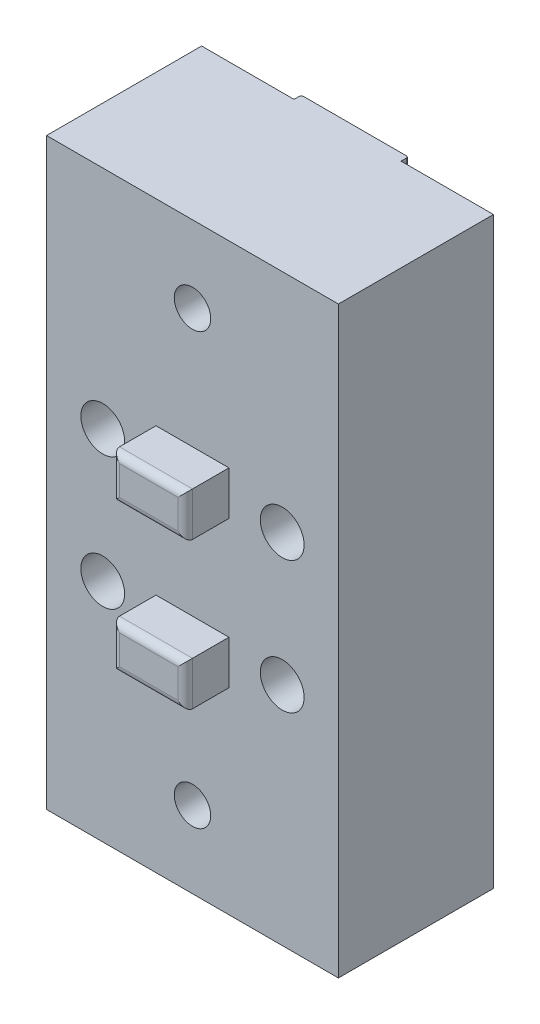
ISO-10303-21;
HEADER;
FILE_DESCRIPTION(('STEP AP214'),'2;1');
FILE_NAME('part.step','',(''),(''),'','','');
FILE_SCHEMA(('AUTOMOTIVE_DESIGN { 1 0 10303 214 1 1 1 1 }'));
ENDSEC;
DATA;
#1=APPLICATION_CONTEXT('core data for automotive mechanical design processes');
#2=APPLICATION_PROTOCOL_DEFINITION('international standard','automotive_design',2000,#1);
#3=PRODUCT_CONTEXT('',#1,'mechanical');
#4=PRODUCT('Part','Part','',(#3));
#5=PRODUCT_RELATED_PRODUCT_CATEGORY('part','',(#4));
#6=PRODUCT_DEFINITION_FORMATION('','',#4);
#7=PRODUCT_DEFINITION_CONTEXT('part definition',#1,'design');
#8=PRODUCT_DEFINITION('design','',#6,#7);
#9=PRODUCT_DEFINITION_SHAPE('','',#8);
#10=(LENGTH_UNIT() NAMED_UNIT(*) SI_UNIT(.MILLI.,.METRE.));
#11=(NAMED_UNIT(*) PLANE_ANGLE_UNIT() SI_UNIT($,.RADIAN.));
#12=(NAMED_UNIT(*) SI_UNIT($,.STERADIAN.) SOLID_ANGLE_UNIT());
#13=UNCERTAINTY_MEASURE_WITH_UNIT(LENGTH_MEASURE(1.E-05),#10,'distance_accuracy_value','');
#14=(GEOMETRIC_REPRESENTATION_CONTEXT(3) GLOBAL_UNCERTAINTY_ASSIGNED_CONTEXT((#13)) GLOBAL_UNIT_ASSIGNED_CONTEXT((#10,
#11,#12)) REPRESENTATION_CONTEXT('',''));
#15=CARTESIAN_POINT('',(0.,0.,0.));
#16=DIRECTION('',(0.,0.,1.));
#17=DIRECTION('',(1.,0.,0.));
#18=AXIS2_PLACEMENT_3D('',#15,#16,#17);
#19=CARTESIAN_POINT('',(12.3,9.05,21.25));
#20=DIRECTION('',(0.,0.,-1.));
#21=DIRECTION('',(-1.,0.,0.));
#22=AXIS2_PLACEMENT_3D('',#19,#20,#21);
#23=CYLINDRICAL_SURFACE('',#22,2.);
#24=CARTESIAN_POINT('',(12.3,9.05,0.));
#25=DIRECTION('',(0.,0.,1.));
#26=DIRECTION('',(1.,0.,0.));
#27=AXIS2_PLACEMENT_3D('',#24,#25,#26);
#28=CIRCLE('',#27,2.);
#29=CARTESIAN_POINT('',(14.3,9.05,0.));
#30=VERTEX_POINT('',#29);
#31=EDGE_CURVE('E288',#30,#30,#28,.T.);
#32=ORIENTED_EDGE('',*,*,#31,.F.);
#33=EDGE_LOOP('',(#32));
#34=FACE_BOUND('',#33,.T.);
#35=CARTESIAN_POINT('',(12.3,9.05,15.25));
#36=DIRECTION('',(0.,0.,1.));
#37=DIRECTION('',(1.,0.,0.));
#38=AXIS2_PLACEMENT_3D('',#35,#36,#37);
#39=CIRCLE('',#38,2.);
#40=CARTESIAN_POINT('',(14.3,9.05,15.25));
#41=VERTEX_POINT('',#40);
#42=EDGE_CURVE('E357',#41,#41,#39,.T.);
#43=ORIENTED_EDGE('',*,*,#42,.T.);
#44=EDGE_LOOP('',(#43));
#45=FACE_BOUND('',#44,.T.);
#46=ADVANCED_FACE('F63',(#34,#45),#23,.F.);
#47=CARTESIAN_POINT('',(12.3,-9.05,21.25));
#48=DIRECTION('',(0.,0.,-1.));
#49=DIRECTION('',(-1.,0.,0.));
#50=AXIS2_PLACEMENT_3D('',#47,#48,#49);
#51=CYLINDRICAL_SURFACE('',#50,2.);
#52=CARTESIAN_POINT('',(12.3,-9.05,0.));
#53=DIRECTION('',(0.,0.,1.));
#54=DIRECTION('',(1.,0.,0.));
#55=AXIS2_PLACEMENT_3D('',#52,#53,#54);
#56=CIRCLE('',#55,2.);
#57=CARTESIAN_POINT('',(14.3,-9.05,0.));
#58=VERTEX_POINT('',#57);
#59=EDGE_CURVE('E285',#58,#58,#56,.T.);
#60=ORIENTED_EDGE('',*,*,#59,.F.);
#61=EDGE_LOOP('',(#60));
#62=FACE_BOUND('',#61,.T.);
#63=CARTESIAN_POINT('',(12.3,-9.05,15.25));
#64=DIRECTION('',(0.,0.,1.));
#65=DIRECTION('',(1.,0.,0.));
#66=AXIS2_PLACEMENT_3D('',#63,#64,#65);
#67=CIRCLE('',#66,2.);
#68=CARTESIAN_POINT('',(14.3,-9.05,15.25));
#69=VERTEX_POINT('',#68);
#70=EDGE_CURVE('E354',#69,#69,#67,.T.);
#71=ORIENTED_EDGE('',*,*,#70,.T.);
#72=EDGE_LOOP('',(#71));
#73=FACE_BOUND('',#72,.T.);
#74=ADVANCED_FACE('F445',(#62,#73),#51,.F.);
#75=CARTESIAN_POINT('',(-12.3,9.05,21.25));
#76=DIRECTION('',(0.,0.,-1.));
#77=DIRECTION('',(-1.,0.,0.));
#78=AXIS2_PLACEMENT_3D('',#75,#76,#77);
#79=CYLINDRICAL_SURFACE('',#78,2.);
#80=CARTESIAN_POINT('',(-12.3,9.05,0.));
#81=DIRECTION('',(0.,0.,1.));
#82=DIRECTION('',(1.,0.,0.));
#83=AXIS2_PLACEMENT_3D('',#80,#81,#82);
#84=CIRCLE('',#83,2.);
#85=CARTESIAN_POINT('',(-10.3,9.05,0.));
#86=VERTEX_POINT('',#85);
#87=EDGE_CURVE('E282',#86,#86,#84,.T.);
#88=ORIENTED_EDGE('',*,*,#87,.F.);
#89=EDGE_LOOP('',(#88));
#90=FACE_BOUND('',#89,.T.);
#91=CARTESIAN_POINT('',(-12.3,9.05,15.25));
#92=DIRECTION('',(0.,0.,1.));
#93=DIRECTION('',(1.,0.,0.));
#94=AXIS2_PLACEMENT_3D('',#91,#92,#93);
#95=CIRCLE('',#94,2.);
#96=CARTESIAN_POINT('',(-10.3,9.05,15.25));
#97=VERTEX_POINT('',#96);
#98=EDGE_CURVE('E350',#97,#97,#95,.T.);
#99=ORIENTED_EDGE('',*,*,#98,.T.);
#100=EDGE_LOOP('',(#99));
#101=FACE_BOUND('',#100,.T.);
#102=ADVANCED_FACE('F452',(#90,#101),#79,.F.);
#103=CARTESIAN_POINT('',(-12.3,-9.05,21.25));
#104=DIRECTION('',(0.,0.,-1.));
#105=DIRECTION('',(-1.,0.,0.));
#106=AXIS2_PLACEMENT_3D('',#103,#104,#105);
#107=CYLINDRICAL_SURFACE('',#106,2.);
#108=CARTESIAN_POINT('',(-12.3,-9.05,0.));
#109=DIRECTION('',(0.,0.,1.));
#110=DIRECTION('',(1.,0.,0.));
#111=AXIS2_PLACEMENT_3D('',#108,#109,#110);
#112=CIRCLE('',#111,2.);
#113=CARTESIAN_POINT('',(-10.3,-9.05,0.));
#114=VERTEX_POINT('',#113);
#115=EDGE_CURVE('E279',#114,#114,#112,.T.);
#116=ORIENTED_EDGE('',*,*,#115,.F.);
#117=EDGE_LOOP('',(#116));
#118=FACE_BOUND('',#117,.T.);
#119=CARTESIAN_POINT('',(-12.3,-9.05,15.25));
#120=DIRECTION('',(0.,0.,1.));
#121=DIRECTION('',(1.,0.,0.));
#122=AXIS2_PLACEMENT_3D('',#119,#120,#121);
#123=CIRCLE('',#122,2.);
#124=CARTESIAN_POINT('',(-10.3,-9.05,15.25));
#125=VERTEX_POINT('',#124);
#126=EDGE_CURVE('E347',#125,#125,#123,.T.);
#127=ORIENTED_EDGE('',*,*,#126,.T.);
#128=EDGE_LOOP('',(#127));
#129=FACE_BOUND('',#128,.T.);
#130=ADVANCED_FACE('F491',(#118,#129),#107,.F.);
#131=CARTESIAN_POINT('',(-7.085,-40.,-0.75));
#132=DIRECTION('',(0.,1.,0.));
#133=DIRECTION('',(0.,0.,1.));
#134=AXIS2_PLACEMENT_3D('',#131,#132,#133);
#135=CYLINDRICAL_SURFACE('',#134,0.25);
#136=DIRECTION('',(0.,-1.,0.));
#137=VECTOR('',#136,1.);
#138=CARTESIAN_POINT('',(-7.335,-40.,-0.75));
#139=LINE('',#138,#137);
#140=CARTESIAN_POINT('',(-7.335,40.,-0.75));
#141=VERTEX_POINT('',#140);
#142=CARTESIAN_POINT('',(-7.335,-40.,-0.75));
#143=VERTEX_POINT('',#142);
#144=EDGE_CURVE('E336',#141,#143,#139,.T.);
#145=ORIENTED_EDGE('',*,*,#144,.F.);
#146=CARTESIAN_POINT('',(-7.085,40.,-0.75));
#147=DIRECTION('',(0.,-1.,0.));
#148=DIRECTION('',(0.,0.,-1.));
#149=AXIS2_PLACEMENT_3D('',#146,#147,#148);
#150=CIRCLE('',#149,0.25);
#151=CARTESIAN_POINT('',(-7.085,40.,-1.));
#152=VERTEX_POINT('',#151);
#153=EDGE_CURVE('E342',#152,#141,#150,.F.);
#154=ORIENTED_EDGE('',*,*,#153,.F.);
#155=DIRECTION('',(0.,-1.,0.));
#156=VECTOR('',#155,1.);
#157=CARTESIAN_POINT('',(-7.085,-40.,-1.));
#158=LINE('',#157,#156);
#159=CARTESIAN_POINT('',(-7.085,-40.,-1.));
#160=VERTEX_POINT('',#159);
#161=EDGE_CURVE('E339',#160,#152,#158,.F.);
#162=ORIENTED_EDGE('',*,*,#161,.F.);
#163=CARTESIAN_POINT('',(-7.085,-40.,-0.75));
#164=DIRECTION('',(0.,1.,0.));
#165=DIRECTION('',(0.,0.,1.));
#166=AXIS2_PLACEMENT_3D('',#163,#164,#165);
#167=CIRCLE('',#166,0.25);
#168=EDGE_CURVE('E344',#143,#160,#167,.F.);
#169=ORIENTED_EDGE('',*,*,#168,.F.);
#170=EDGE_LOOP('',(#145,#154,#162,#169));
#171=FACE_BOUND('',#170,.T.);
#172=ADVANCED_FACE('F487',(#171),#135,.T.);
#173=CARTESIAN_POINT('',(7.085,40.,-0.75));
#174=DIRECTION('',(0.,-1.,0.));
#175=DIRECTION('',(0.,0.,-1.));
#176=AXIS2_PLACEMENT_3D('',#173,#174,#175);
#177=CYLINDRICAL_SURFACE('',#176,0.25);
#178=DIRECTION('',(0.,1.,0.));
#179=VECTOR('',#178,1.);
#180=CARTESIAN_POINT('',(7.335,40.,-0.75));
#181=LINE('',#180,#179);
#182=CARTESIAN_POINT('',(7.335,-40.,-0.75));
#183=VERTEX_POINT('',#182);
#184=CARTESIAN_POINT('',(7.335,40.,-0.75));
#185=VERTEX_POINT('',#184);
#186=EDGE_CURVE('E325',#183,#185,#181,.T.);
#187=ORIENTED_EDGE('',*,*,#186,.F.);
#188=CARTESIAN_POINT('',(7.085,-40.,-0.75));
#189=DIRECTION('',(0.,1.,0.));
#190=DIRECTION('',(0.,0.,1.));
#191=AXIS2_PLACEMENT_3D('',#188,#189,#190);
#192=CIRCLE('',#191,0.25);
#193=CARTESIAN_POINT('',(7.085,-40.,-1.));
#194=VERTEX_POINT('',#193);
#195=EDGE_CURVE('E331',#194,#183,#192,.F.);
#196=ORIENTED_EDGE('',*,*,#195,.F.);
#197=DIRECTION('',(0.,1.,0.));
#198=VECTOR('',#197,1.);
#199=CARTESIAN_POINT('',(7.085,40.,-1.));
#200=LINE('',#199,#198);
#201=CARTESIAN_POINT('',(7.085,40.,-1.));
#202=VERTEX_POINT('',#201);
#203=EDGE_CURVE('E328',#202,#194,#200,.F.);
#204=ORIENTED_EDGE('',*,*,#203,.F.);
#205=CARTESIAN_POINT('',(7.085,40.,-0.75));
#206=DIRECTION('',(0.,-1.,0.));
#207=DIRECTION('',(0.,0.,-1.));
#208=AXIS2_PLACEMENT_3D('',#205,#206,#207);
#209=CIRCLE('',#208,0.25);
#210=EDGE_CURVE('E333',#185,#202,#209,.F.);
#211=ORIENTED_EDGE('',*,*,#210,.F.);
#212=EDGE_LOOP('',(#187,#196,#204,#211));
#213=FACE_BOUND('',#212,.T.);
#214=ADVANCED_FACE('F467',(#213),#177,.T.);
#215=CARTESIAN_POINT('',(0.,0.,0.));
#216=DIRECTION('',(0.,0.,1.));
#217=DIRECTION('',(1.,0.,0.));
#218=AXIS2_PLACEMENT_3D('',#215,#216,#217);
#219=PLANE('',#218);
#220=ORIENTED_EDGE('',*,*,#115,.T.);
#221=EDGE_LOOP('',(#220));
#222=FACE_BOUND('',#221,.T.);
#223=ORIENTED_EDGE('',*,*,#87,.T.);
#224=EDGE_LOOP('',(#223));
#225=FACE_BOUND('',#224,.T.);
#226=DIRECTION('',(0.,1.,0.));
#227=VECTOR('',#226,1.);
#228=CARTESIAN_POINT('',(-7.335,-40.,0.));
#229=LINE('',#228,#227);
#230=CARTESIAN_POINT('',(-7.335,-40.,0.));
#231=VERTEX_POINT('',#230);
#232=CARTESIAN_POINT('',(-7.335,40.,0.));
#233=VERTEX_POINT('',#232);
#234=EDGE_CURVE('E264',#231,#233,#229,.T.);
#235=ORIENTED_EDGE('',*,*,#234,.F.);
#236=DIRECTION('',(1.,0.,0.));
#237=VECTOR('',#236,1.);
#238=CARTESIAN_POINT('',(-20.,-40.,0.));
#239=LINE('',#238,#237);
#240=CARTESIAN_POINT('',(-20.,-40.,0.));
#241=VERTEX_POINT('',#240);
#242=EDGE_CURVE('E306',#241,#231,#239,.T.);
#243=ORIENTED_EDGE('',*,*,#242,.F.);
#244=DIRECTION('',(0.,-1.,0.));
#245=VECTOR('',#244,1.);
#246=CARTESIAN_POINT('',(-20.,40.,0.));
#247=LINE('',#246,#245);
#248=CARTESIAN_POINT('',(-20.,40.,0.));
#249=VERTEX_POINT('',#248);
#250=EDGE_CURVE('E291',#249,#241,#247,.T.);
#251=ORIENTED_EDGE('',*,*,#250,.F.);
#252=DIRECTION('',(-1.,0.,0.));
#253=VECTOR('',#252,1.);
#254=CARTESIAN_POINT('',(-20.,40.,0.));
#255=LINE('',#254,#253);
#256=EDGE_CURVE('E311',#233,#249,#255,.T.);
#257=ORIENTED_EDGE('',*,*,#256,.F.);
#258=EDGE_LOOP('',(#235,#243,#251,#257));
#259=FACE_BOUND('',#258,.T.);
#260=ADVANCED_FACE('F464',(#222,#225,#259),#219,.F.);
#261=ORIENTED_EDGE('',*,*,#59,.T.);
#262=EDGE_LOOP('',(#261));
#263=FACE_BOUND('',#262,.T.);
#264=ORIENTED_EDGE('',*,*,#31,.T.);
#265=EDGE_LOOP('',(#264));
#266=FACE_BOUND('',#265,.T.);
#267=DIRECTION('',(0.,-1.,0.));
#268=VECTOR('',#267,1.);
#269=CARTESIAN_POINT('',(7.335,40.,0.));
#270=LINE('',#269,#268);
#271=CARTESIAN_POINT('',(7.335,40.,0.));
#272=VERTEX_POINT('',#271);
#273=CARTESIAN_POINT('',(7.335,-40.,0.));
#274=VERTEX_POINT('',#273);
#275=EDGE_CURVE('E260',#272,#274,#270,.T.);
#276=ORIENTED_EDGE('',*,*,#275,.F.);
#277=CARTESIAN_POINT('',(20.,40.,0.));
#278=VERTEX_POINT('',#277);
#279=EDGE_CURVE('E296',#278,#272,#255,.T.);
#280=ORIENTED_EDGE('',*,*,#279,.F.);
#281=DIRECTION('',(0.,1.,0.));
#282=VECTOR('',#281,1.);
#283=CARTESIAN_POINT('',(20.,40.,0.));
#284=LINE('',#283,#282);
#285=CARTESIAN_POINT('',(20.,-40.,0.));
#286=VERTEX_POINT('',#285);
#287=EDGE_CURVE('E309',#286,#278,#284,.T.);
#288=ORIENTED_EDGE('',*,*,#287,.F.);
#289=EDGE_CURVE('E305',#274,#286,#239,.T.);
#290=ORIENTED_EDGE('',*,*,#289,.F.);
#291=EDGE_LOOP('',(#276,#280,#288,#290));
#292=FACE_BOUND('',#291,.T.);
#293=ADVANCED_FACE('F462',(#263,#266,#292),#219,.F.);
#294=CARTESIAN_POINT('',(0.,0.,21.25));
#295=DIRECTION('',(0.,0.,1.));
#296=DIRECTION('',(1.,0.,0.));
#297=AXIS2_PLACEMENT_3D('',#294,#295,#296);
#298=PLANE('',#297);
#299=CARTESIAN_POINT('',(-12.3,-9.05,21.25));
#300=DIRECTION('',(0.,0.,1.));
#301=DIRECTION('',(1.,0.,0.));
#302=AXIS2_PLACEMENT_3D('',#299,#300,#301);
#303=CIRCLE('',#302,3.);
#304=CARTESIAN_POINT('',(-9.3,-9.05,21.25));
#305=VERTEX_POINT('',#304);
#306=EDGE_CURVE('E871',#305,#305,#303,.T.);
#307=ORIENTED_EDGE('',*,*,#306,.F.);
#308=EDGE_LOOP('',(#307));
#309=FACE_BOUND('',#308,.T.);
#310=CARTESIAN_POINT('',(12.3,-9.05,21.25));
#311=DIRECTION('',(0.,0.,1.));
#312=DIRECTION('',(1.,0.,0.));
#313=AXIS2_PLACEMENT_3D('',#310,#311,#312);
#314=CIRCLE('',#313,3.);
#315=CARTESIAN_POINT('',(15.3,-9.05,21.25));
#316=VERTEX_POINT('',#315);
#317=EDGE_CURVE('E870',#316,#316,#314,.T.);
#318=ORIENTED_EDGE('',*,*,#317,.F.);
#319=EDGE_LOOP('',(#318));
#320=FACE_BOUND('',#319,.T.);
#321=CARTESIAN_POINT('',(12.3,9.05,21.25));
#322=DIRECTION('',(0.,0.,1.));
#323=DIRECTION('',(1.,0.,0.));
#324=AXIS2_PLACEMENT_3D('',#321,#322,#323);
#325=CIRCLE('',#324,3.);
#326=CARTESIAN_POINT('',(15.3,9.05,21.25));
#327=VERTEX_POINT('',#326);
#328=EDGE_CURVE('E887',#327,#327,#325,.T.);
#329=ORIENTED_EDGE('',*,*,#328,.F.);
#330=EDGE_LOOP('',(#329));
#331=FACE_BOUND('',#330,.T.);
#332=CARTESIAN_POINT('',(-12.3,9.05,21.25));
#333=DIRECTION('',(0.,0.,1.));
#334=DIRECTION('',(1.,0.,0.));
#335=AXIS2_PLACEMENT_3D('',#332,#333,#334);
#336=CIRCLE('',#335,3.);
#337=CARTESIAN_POINT('',(-9.3,9.05,21.25));
#338=VERTEX_POINT('',#337);
#339=EDGE_CURVE('E884',#338,#338,#336,.T.);
#340=ORIENTED_EDGE('',*,*,#339,.F.);
#341=EDGE_LOOP('',(#340));
#342=FACE_BOUND('',#341,.T.);
#343=CARTESIAN_POINT('',(0.,29.5,21.25));
#344=DIRECTION('',(0.,0.,1.));
#345=DIRECTION('',(1.,0.,0.));
#346=AXIS2_PLACEMENT_3D('',#343,#344,#345);
#347=CIRCLE('',#346,2.5);
#348=CARTESIAN_POINT('',(2.5,29.5,21.25));
#349=VERTEX_POINT('',#348);
#350=EDGE_CURVE('E896',#349,#349,#347,.T.);
#351=ORIENTED_EDGE('',*,*,#350,.F.);
#352=EDGE_LOOP('',(#351));
#353=FACE_BOUND('',#352,.T.);
#354=CARTESIAN_POINT('',(0.,-29.5,21.25));
#355=DIRECTION('',(0.,0.,1.));
#356=DIRECTION('',(1.,0.,0.));
#357=AXIS2_PLACEMENT_3D('',#354,#355,#356);
#358=CIRCLE('',#357,2.5);
#359=CARTESIAN_POINT('',(2.5,-29.5,21.25));
#360=VERTEX_POINT('',#359);
#361=EDGE_CURVE('E891',#360,#360,#358,.T.);
#362=ORIENTED_EDGE('',*,*,#361,.F.);
#363=EDGE_LOOP('',(#362));
#364=FACE_BOUND('',#363,.T.);
#365=DIRECTION('',(1.,0.,0.));
#366=VECTOR('',#365,1.);
#367=CARTESIAN_POINT('',(0.,13.05,21.25));
#368=LINE('',#367,#366);
#369=CARTESIAN_POINT('',(-5.,13.05,21.25));
#370=VERTEX_POINT('',#369);
#371=CARTESIAN_POINT('',(5.,13.05,21.25));
#372=VERTEX_POINT('',#371);
#373=EDGE_CURVE('E235',#370,#372,#368,.T.);
#374=ORIENTED_EDGE('',*,*,#373,.T.);
#375=DIRECTION('',(0.,1.,0.));
#376=VECTOR('',#375,1.);
#377=CARTESIAN_POINT('',(5.,0.,21.25));
#378=LINE('',#377,#376);
#379=CARTESIAN_POINT('',(5.,7.05,21.25));
#380=VERTEX_POINT('',#379);
#381=EDGE_CURVE('E232',#380,#372,#378,.T.);
#382=ORIENTED_EDGE('',*,*,#381,.F.);
#383=DIRECTION('',(1.,0.,0.));
#384=VECTOR('',#383,1.);
#385=CARTESIAN_POINT('',(0.,7.05,21.25));
#386=LINE('',#385,#384);
#387=CARTESIAN_POINT('',(-5.,7.05,21.25));
#388=VERTEX_POINT('',#387);
#389=EDGE_CURVE('E216',#388,#380,#386,.T.);
#390=ORIENTED_EDGE('',*,*,#389,.F.);
#391=DIRECTION('',(0.,1.,0.));
#392=VECTOR('',#391,1.);
#393=CARTESIAN_POINT('',(-5.,0.,21.25));
#394=LINE('',#393,#392);
#395=EDGE_CURVE('E229',#388,#370,#394,.T.);
#396=ORIENTED_EDGE('',*,*,#395,.T.);
#397=EDGE_LOOP('',(#374,#382,#390,#396));
#398=FACE_BOUND('',#397,.T.);
#399=DIRECTION('',(0.,-1.,0.));
#400=VECTOR('',#399,1.);
#401=CARTESIAN_POINT('',(5.,0.,21.25));
#402=LINE('',#401,#400);
#403=CARTESIAN_POINT('',(5.,-7.05,21.25));
#404=VERTEX_POINT('',#403);
#405=CARTESIAN_POINT('',(5.,-13.05,21.25));
#406=VERTEX_POINT('',#405);
#407=EDGE_CURVE('E237',#404,#406,#402,.T.);
#408=ORIENTED_EDGE('',*,*,#407,.T.);
#409=DIRECTION('',(1.,0.,0.));
#410=VECTOR('',#409,1.);
#411=CARTESIAN_POINT('',(0.,-13.05,21.25));
#412=LINE('',#411,#410);
#413=CARTESIAN_POINT('',(-5.,-13.05,21.25));
#414=VERTEX_POINT('',#413);
#415=EDGE_CURVE('E249',#414,#406,#412,.T.);
#416=ORIENTED_EDGE('',*,*,#415,.F.);
#417=DIRECTION('',(0.,-1.,0.));
#418=VECTOR('',#417,1.);
#419=CARTESIAN_POINT('',(-5.,0.,21.25));
#420=LINE('',#419,#418);
#421=CARTESIAN_POINT('',(-5.,-7.05,21.25));
#422=VERTEX_POINT('',#421);
#423=EDGE_CURVE('E246',#422,#414,#420,.T.);
#424=ORIENTED_EDGE('',*,*,#423,.F.);
#425=DIRECTION('',(1.,0.,0.));
#426=VECTOR('',#425,1.);
#427=CARTESIAN_POINT('',(0.,-7.05,21.25));
#428=LINE('',#427,#426);
#429=EDGE_CURVE('E243',#422,#404,#428,.T.);
#430=ORIENTED_EDGE('',*,*,#429,.T.);
#431=EDGE_LOOP('',(#408,#416,#424,#430));
#432=FACE_BOUND('',#431,.T.);
#433=DIRECTION('',(0.,-1.,0.));
#434=VECTOR('',#433,1.);
#435=CARTESIAN_POINT('',(-20.,40.,21.25));
#436=LINE('',#435,#434);
#437=CARTESIAN_POINT('',(-20.,40.,21.25));
#438=VERTEX_POINT('',#437);
#439=CARTESIAN_POINT('',(-20.,-40.,21.25));
#440=VERTEX_POINT('',#439);
#441=EDGE_CURVE('E292',#438,#440,#436,.T.);
#442=ORIENTED_EDGE('',*,*,#441,.T.);
#443=DIRECTION('',(1.,0.,0.));
#444=VECTOR('',#443,1.);
#445=CARTESIAN_POINT('',(-20.,-40.,21.25));
#446=LINE('',#445,#444);
#447=CARTESIAN_POINT('',(20.,-40.,21.25));
#448=VERTEX_POINT('',#447);
#449=EDGE_CURVE('E295',#440,#448,#446,.T.);
#450=ORIENTED_EDGE('',*,*,#449,.T.);
#451=DIRECTION('',(0.,1.,0.));
#452=VECTOR('',#451,1.);
#453=CARTESIAN_POINT('',(20.,40.,21.25));
#454=LINE('',#453,#452);
#455=CARTESIAN_POINT('',(20.,40.,21.25));
#456=VERTEX_POINT('',#455);
#457=EDGE_CURVE('E298',#448,#456,#454,.T.);
#458=ORIENTED_EDGE('',*,*,#457,.T.);
#459=DIRECTION('',(-1.,0.,0.));
#460=VECTOR('',#459,1.);
#461=CARTESIAN_POINT('',(-20.,40.,21.25));
#462=LINE('',#461,#460);
#463=EDGE_CURVE('E300',#456,#438,#462,.T.);
#464=ORIENTED_EDGE('',*,*,#463,.T.);
#465=EDGE_LOOP('',(#442,#450,#458,#464));
#466=FACE_BOUND('',#465,.T.);
#467=ADVANCED_FACE('F227',(#309,#320,#331,#342,#353,#364,#398,#432,#466),#298,.T.);
#468=CARTESIAN_POINT('',(-20.,40.,21.25));
#469=DIRECTION('',(1.,0.,0.));
#470=DIRECTION('',(0.,0.,-1.));
#471=AXIS2_PLACEMENT_3D('',#468,#469,#470);
#472=PLANE('',#471);
#473=ORIENTED_EDGE('',*,*,#250,.T.);
#474=DIRECTION('',(0.,0.,-1.));
#475=VECTOR('',#474,1.);
#476=CARTESIAN_POINT('',(-20.,-40.,21.25));
#477=LINE('',#476,#475);
#478=EDGE_CURVE('E322',#440,#241,#477,.T.);
#479=ORIENTED_EDGE('',*,*,#478,.F.);
#480=ORIENTED_EDGE('',*,*,#441,.F.);
#481=DIRECTION('',(0.,0.,-1.));
#482=VECTOR('',#481,1.);
#483=CARTESIAN_POINT('',(-20.,40.,21.25));
#484=LINE('',#483,#482);
#485=EDGE_CURVE('E302',#438,#249,#484,.T.);
#486=ORIENTED_EDGE('',*,*,#485,.T.);
#487=EDGE_LOOP('',(#473,#479,#480,#486));
#488=FACE_BOUND('',#487,.T.);
#489=ADVANCED_FACE('F461',(#488),#472,.F.);
#490=CARTESIAN_POINT('',(-20.,-40.,21.25));
#491=DIRECTION('',(0.,1.,0.));
#492=DIRECTION('',(0.,0.,1.));
#493=AXIS2_PLACEMENT_3D('',#490,#491,#492);
#494=PLANE('',#493);
#495=DIRECTION('',(0.,0.,1.));
#496=VECTOR('',#495,1.);
#497=CARTESIAN_POINT('',(-7.335,-40.,-1.));
#498=LINE('',#497,#496);
#499=EDGE_CURVE('E273',#143,#231,#498,.T.);
#500=ORIENTED_EDGE('',*,*,#499,.F.);
#501=ORIENTED_EDGE('',*,*,#168,.T.);
#502=DIRECTION('',(-1.,0.,0.));
#503=VECTOR('',#502,1.);
#504=CARTESIAN_POINT('',(7.335,-40.,-1.));
#505=LINE('',#504,#503);
#506=EDGE_CURVE('E263',#194,#160,#505,.T.);
#507=ORIENTED_EDGE('',*,*,#506,.F.);
#508=ORIENTED_EDGE('',*,*,#195,.T.);
#509=DIRECTION('',(0.,0.,1.));
#510=VECTOR('',#509,1.);
#511=CARTESIAN_POINT('',(7.335,-40.,-1.));
#512=LINE('',#511,#510);
#513=EDGE_CURVE('E275',#183,#274,#512,.T.);
#514=ORIENTED_EDGE('',*,*,#513,.T.);
#515=ORIENTED_EDGE('',*,*,#289,.T.);
#516=DIRECTION('',(0.,0.,-1.));
#517=VECTOR('',#516,1.);
#518=CARTESIAN_POINT('',(20.,-40.,21.25));
#519=LINE('',#518,#517);
#520=EDGE_CURVE('E319',#448,#286,#519,.T.);
#521=ORIENTED_EDGE('',*,*,#520,.F.);
#522=ORIENTED_EDGE('',*,*,#449,.F.);
#523=ORIENTED_EDGE('',*,*,#478,.T.);
#524=ORIENTED_EDGE('',*,*,#242,.T.);
#525=EDGE_LOOP('',(#500,#501,#507,#508,#514,#515,#521,#522,#523,#524));
#526=FACE_BOUND('',#525,.T.);
#527=ADVANCED_FACE('F477',(#526),#494,.F.);
#528=CARTESIAN_POINT('',(20.,40.,21.25));
#529=DIRECTION('',(-1.,0.,0.));
#530=DIRECTION('',(0.,0.,1.));
#531=AXIS2_PLACEMENT_3D('',#528,#529,#530);
#532=PLANE('',#531);
#533=ORIENTED_EDGE('',*,*,#287,.T.);
#534=DIRECTION('',(0.,0.,-1.));
#535=VECTOR('',#534,1.);
#536=CARTESIAN_POINT('',(20.,40.,21.25));
#537=LINE('',#536,#535);
#538=EDGE_CURVE('E316',#456,#278,#537,.T.);
#539=ORIENTED_EDGE('',*,*,#538,.F.);
#540=ORIENTED_EDGE('',*,*,#457,.F.);
#541=ORIENTED_EDGE('',*,*,#520,.T.);
#542=EDGE_LOOP('',(#533,#539,#540,#541));
#543=FACE_BOUND('',#542,.T.);
#544=ADVANCED_FACE('F473',(#543),#532,.F.);
#545=CARTESIAN_POINT('',(-20.,40.,21.25));
#546=DIRECTION('',(0.,-1.,0.));
#547=DIRECTION('',(0.,0.,-1.));
#548=AXIS2_PLACEMENT_3D('',#545,#546,#547);
#549=PLANE('',#548);
#550=DIRECTION('',(1.,0.,0.));
#551=VECTOR('',#550,1.);
#552=CARTESIAN_POINT('',(-7.335,40.,-1.));
#553=LINE('',#552,#551);
#554=EDGE_CURVE('E261',#152,#202,#553,.T.);
#555=ORIENTED_EDGE('',*,*,#554,.F.);
#556=ORIENTED_EDGE('',*,*,#153,.T.);
#557=DIRECTION('',(0.,0.,1.));
#558=VECTOR('',#557,1.);
#559=CARTESIAN_POINT('',(-7.335,40.,-1.));
#560=LINE('',#559,#558);
#561=EDGE_CURVE('E267',#141,#233,#560,.T.);
#562=ORIENTED_EDGE('',*,*,#561,.T.);
#563=ORIENTED_EDGE('',*,*,#256,.T.);
#564=ORIENTED_EDGE('',*,*,#485,.F.);
#565=ORIENTED_EDGE('',*,*,#463,.F.);
#566=ORIENTED_EDGE('',*,*,#538,.T.);
#567=ORIENTED_EDGE('',*,*,#279,.T.);
#568=DIRECTION('',(0.,0.,1.));
#569=VECTOR('',#568,1.);
#570=CARTESIAN_POINT('',(7.335,40.,-1.));
#571=LINE('',#570,#569);
#572=EDGE_CURVE('E277',#185,#272,#571,.T.);
#573=ORIENTED_EDGE('',*,*,#572,.F.);
#574=ORIENTED_EDGE('',*,*,#210,.T.);
#575=EDGE_LOOP('',(#555,#556,#562,#563,#564,#565,#566,#567,#573,#574));
#576=FACE_BOUND('',#575,.T.);
#577=ADVANCED_FACE('F469',(#576),#549,.F.);
#578=CARTESIAN_POINT('',(7.335,40.,-1.));
#579=DIRECTION('',(-1.,0.,0.));
#580=DIRECTION('',(0.,0.,1.));
#581=AXIS2_PLACEMENT_3D('',#578,#579,#580);
#582=PLANE('',#581);
#583=ORIENTED_EDGE('',*,*,#513,.F.);
#584=ORIENTED_EDGE('',*,*,#186,.T.);
#585=ORIENTED_EDGE('',*,*,#572,.T.);
#586=ORIENTED_EDGE('',*,*,#275,.T.);
#587=EDGE_LOOP('',(#583,#584,#585,#586));
#588=FACE_BOUND('',#587,.T.);
#589=ADVANCED_FACE('F472',(#588),#582,.F.);
#590=CARTESIAN_POINT('',(-7.335,-40.,-1.));
#591=DIRECTION('',(1.,0.,0.));
#592=DIRECTION('',(0.,0.,-1.));
#593=AXIS2_PLACEMENT_3D('',#590,#591,#592);
#594=PLANE('',#593);
#595=ORIENTED_EDGE('',*,*,#561,.F.);
#596=ORIENTED_EDGE('',*,*,#144,.T.);
#597=ORIENTED_EDGE('',*,*,#499,.T.);
#598=ORIENTED_EDGE('',*,*,#234,.T.);
#599=EDGE_LOOP('',(#595,#596,#597,#598));
#600=FACE_BOUND('',#599,.T.);
#601=ADVANCED_FACE('F761',(#600),#594,.F.);
#602=CARTESIAN_POINT('',(0.,0.,-1.));
#603=DIRECTION('',(0.,0.,-1.));
#604=DIRECTION('',(-1.,0.,0.));
#605=AXIS2_PLACEMENT_3D('',#602,#603,#604);
#606=PLANE('',#605);
#607=CARTESIAN_POINT('',(0.,29.5,-1.));
#608=DIRECTION('',(0.,0.,-1.));
#609=DIRECTION('',(-1.,0.,0.));
#610=AXIS2_PLACEMENT_3D('',#607,#608,#609);
#611=CIRCLE('',#610,2.5);
#612=CARTESIAN_POINT('',(-2.5,29.5,-1.));
#613=VERTEX_POINT('',#612);
#614=EDGE_CURVE('E888',#613,#613,#611,.T.);
#615=ORIENTED_EDGE('',*,*,#614,.F.);
#616=EDGE_LOOP('',(#615));
#617=FACE_BOUND('',#616,.T.);
#618=CARTESIAN_POINT('',(0.,-29.5,-1.));
#619=DIRECTION('',(0.,0.,-1.));
#620=DIRECTION('',(1.,0.,0.));
#621=AXIS2_PLACEMENT_3D('',#618,#619,#620);
#622=CIRCLE('',#621,2.5);
#623=CARTESIAN_POINT('',(2.5,-29.5,-1.));
#624=VERTEX_POINT('',#623);
#625=EDGE_CURVE('E360',#624,#624,#622,.T.);
#626=ORIENTED_EDGE('',*,*,#625,.F.);
#627=EDGE_LOOP('',(#626));
#628=FACE_BOUND('',#627,.T.);
#629=ORIENTED_EDGE('',*,*,#506,.T.);
#630=ORIENTED_EDGE('',*,*,#161,.T.);
#631=ORIENTED_EDGE('',*,*,#554,.T.);
#632=ORIENTED_EDGE('',*,*,#203,.T.);
#633=EDGE_LOOP('',(#629,#630,#631,#632));
#634=FACE_BOUND('',#633,.T.);
#635=ADVANCED_FACE('F735',(#617,#628,#634),#606,.T.);
#636=CARTESIAN_POINT('',(5.,0.,27.25));
#637=DIRECTION('',(1.,0.,0.));
#638=DIRECTION('',(0.,0.,-1.));
#639=AXIS2_PLACEMENT_3D('',#636,#637,#638);
#640=PLANE('',#639);
#641=DIRECTION('',(0.,0.,-1.));
#642=VECTOR('',#641,1.);
#643=CARTESIAN_POINT('',(5.,-7.05,27.25));
#644=LINE('',#643,#642);
#645=CARTESIAN_POINT('',(5.,-7.05,26.25));
#646=VERTEX_POINT('',#645);
#647=EDGE_CURVE('E258',#646,#404,#644,.T.);
#648=ORIENTED_EDGE('',*,*,#647,.F.);
#649=DIRECTION('',(0.,-1.,0.));
#650=VECTOR('',#649,1.);
#651=CARTESIAN_POINT('',(5.,0.,26.25));
#652=LINE('',#651,#650);
#653=CARTESIAN_POINT('',(5.,-13.05,26.25));
#654=VERTEX_POINT('',#653);
#655=EDGE_CURVE('E346',#646,#654,#652,.T.);
#656=ORIENTED_EDGE('',*,*,#655,.T.);
#657=DIRECTION('',(0.,0.,-1.));
#658=VECTOR('',#657,1.);
#659=CARTESIAN_POINT('',(5.,-13.05,27.25));
#660=LINE('',#659,#658);
#661=EDGE_CURVE('E252',#654,#406,#660,.T.);
#662=ORIENTED_EDGE('',*,*,#661,.T.);
#663=ORIENTED_EDGE('',*,*,#407,.F.);
#664=EDGE_LOOP('',(#648,#656,#662,#663));
#665=FACE_BOUND('',#664,.T.);
#666=ADVANCED_FACE('F727',(#665),#640,.T.);
#667=CARTESIAN_POINT('',(0.,-7.05,27.25));
#668=DIRECTION('',(0.,1.,0.));
#669=DIRECTION('',(0.,0.,1.));
#670=AXIS2_PLACEMENT_3D('',#667,#668,#669);
#671=PLANE('',#670);
#672=DIRECTION('',(0.,0.,-1.));
#673=VECTOR('',#672,1.);
#674=CARTESIAN_POINT('',(-5.,-7.05,27.25));
#675=LINE('',#674,#673);
#676=CARTESIAN_POINT('',(-5.,-7.05,26.25));
#677=VERTEX_POINT('',#676);
#678=EDGE_CURVE('E256',#677,#422,#675,.T.);
#679=ORIENTED_EDGE('',*,*,#678,.F.);
#680=DIRECTION('',(1.,0.,0.));
#681=VECTOR('',#680,1.);
#682=CARTESIAN_POINT('',(0.,-7.05,26.25));
#683=LINE('',#682,#681);
#684=EDGE_CURVE('E376',#677,#646,#683,.T.);
#685=ORIENTED_EDGE('',*,*,#684,.T.);
#686=ORIENTED_EDGE('',*,*,#647,.T.);
#687=ORIENTED_EDGE('',*,*,#429,.F.);
#688=EDGE_LOOP('',(#679,#685,#686,#687));
#689=FACE_BOUND('',#688,.T.);
#690=ADVANCED_FACE('F719',(#689),#671,.T.);
#691=CARTESIAN_POINT('',(-5.,0.,27.25));
#692=DIRECTION('',(1.,0.,0.));
#693=DIRECTION('',(0.,0.,-1.));
#694=AXIS2_PLACEMENT_3D('',#691,#692,#693);
#695=PLANE('',#694);
#696=DIRECTION('',(0.,0.,-1.));
#697=VECTOR('',#696,1.);
#698=CARTESIAN_POINT('',(-5.,-13.05,27.25));
#699=LINE('',#698,#697);
#700=CARTESIAN_POINT('',(-5.,-13.05,26.25));
#701=VERTEX_POINT('',#700);
#702=EDGE_CURVE('E254',#701,#414,#699,.T.);
#703=ORIENTED_EDGE('',*,*,#702,.F.);
#704=DIRECTION('',(0.,-1.,0.));
#705=VECTOR('',#704,1.);
#706=CARTESIAN_POINT('',(-5.,-7.05,26.25));
#707=LINE('',#706,#705);
#708=EDGE_CURVE('E374',#701,#677,#707,.F.);
#709=ORIENTED_EDGE('',*,*,#708,.T.);
#710=ORIENTED_EDGE('',*,*,#678,.T.);
#711=ORIENTED_EDGE('',*,*,#423,.T.);
#712=EDGE_LOOP('',(#703,#709,#710,#711));
#713=FACE_BOUND('',#712,.T.);
#714=ADVANCED_FACE('F710',(#713),#695,.F.);
#715=CARTESIAN_POINT('',(0.,-13.05,27.25));
#716=DIRECTION('',(0.,1.,0.));
#717=DIRECTION('',(0.,0.,1.));
#718=AXIS2_PLACEMENT_3D('',#715,#716,#717);
#719=PLANE('',#718);
#720=ORIENTED_EDGE('',*,*,#661,.F.);
#721=DIRECTION('',(1.,0.,0.));
#722=VECTOR('',#721,1.);
#723=CARTESIAN_POINT('',(-5.,-13.05,26.25));
#724=LINE('',#723,#722);
#725=EDGE_CURVE('E372',#654,#701,#724,.F.);
#726=ORIENTED_EDGE('',*,*,#725,.T.);
#727=ORIENTED_EDGE('',*,*,#702,.T.);
#728=ORIENTED_EDGE('',*,*,#415,.T.);
#729=EDGE_LOOP('',(#720,#726,#727,#728));
#730=FACE_BOUND('',#729,.T.);
#731=ADVANCED_FACE('F702',(#730),#719,.F.);
#732=CARTESIAN_POINT('',(0.,0.,27.25));
#733=DIRECTION('',(0.,0.,1.));
#734=DIRECTION('',(1.,0.,0.));
#735=AXIS2_PLACEMENT_3D('',#732,#733,#734);
#736=PLANE('',#735);
#737=DIRECTION('',(1.,0.,0.));
#738=VECTOR('',#737,1.);
#739=CARTESIAN_POINT('',(5.,-12.05,27.25));
#740=LINE('',#739,#738);
#741=CARTESIAN_POINT('',(-4.,-12.05,27.25));
#742=VERTEX_POINT('',#741);
#743=CARTESIAN_POINT('',(4.,-12.05,27.25));
#744=VERTEX_POINT('',#743);
#745=EDGE_CURVE('E367',#742,#744,#740,.T.);
#746=ORIENTED_EDGE('',*,*,#745,.T.);
#747=DIRECTION('',(0.,-1.,0.));
#748=VECTOR('',#747,1.);
#749=CARTESIAN_POINT('',(4.,0.,27.25));
#750=LINE('',#749,#748);
#751=CARTESIAN_POINT('',(4.,-8.05,27.25));
#752=VERTEX_POINT('',#751);
#753=EDGE_CURVE('E369',#744,#752,#750,.F.);
#754=ORIENTED_EDGE('',*,*,#753,.T.);
#755=DIRECTION('',(1.,0.,0.));
#756=VECTOR('',#755,1.);
#757=CARTESIAN_POINT('',(0.,-8.05,27.25));
#758=LINE('',#757,#756);
#759=CARTESIAN_POINT('',(-4.,-8.05,27.25));
#760=VERTEX_POINT('',#759);
#761=EDGE_CURVE('E363',#752,#760,#758,.F.);
#762=ORIENTED_EDGE('',*,*,#761,.T.);
#763=DIRECTION('',(0.,-1.,0.));
#764=VECTOR('',#763,1.);
#765=CARTESIAN_POINT('',(-4.,-13.05,27.25));
#766=LINE('',#765,#764);
#767=EDGE_CURVE('E365',#760,#742,#766,.T.);
#768=ORIENTED_EDGE('',*,*,#767,.T.);
#769=EDGE_LOOP('',(#746,#754,#762,#768));
#770=FACE_BOUND('',#769,.T.);
#771=ADVANCED_FACE('F694',(#770),#736,.T.);
#772=CARTESIAN_POINT('',(0.,13.05,27.25));
#773=DIRECTION('',(0.,1.,0.));
#774=DIRECTION('',(0.,0.,1.));
#775=AXIS2_PLACEMENT_3D('',#772,#773,#774);
#776=PLANE('',#775);
#777=DIRECTION('',(0.,0.,-1.));
#778=VECTOR('',#777,1.);
#779=CARTESIAN_POINT('',(-5.,13.05,27.25));
#780=LINE('',#779,#778);
#781=CARTESIAN_POINT('',(-5.,13.05,26.25));
#782=VERTEX_POINT('',#781);
#783=EDGE_CURVE('E221',#782,#370,#780,.T.);
#784=ORIENTED_EDGE('',*,*,#783,.F.);
#785=DIRECTION('',(1.,0.,0.));
#786=VECTOR('',#785,1.);
#787=CARTESIAN_POINT('',(0.,13.05,26.25));
#788=LINE('',#787,#786);
#789=CARTESIAN_POINT('',(5.,13.05,26.25));
#790=VERTEX_POINT('',#789);
#791=EDGE_CURVE('E72',#782,#790,#788,.T.);
#792=ORIENTED_EDGE('',*,*,#791,.T.);
#793=DIRECTION('',(0.,0.,-1.));
#794=VECTOR('',#793,1.);
#795=CARTESIAN_POINT('',(5.,13.05,27.25));
#796=LINE('',#795,#794);
#797=EDGE_CURVE('E423',#790,#372,#796,.T.);
#798=ORIENTED_EDGE('',*,*,#797,.T.);
#799=ORIENTED_EDGE('',*,*,#373,.F.);
#800=EDGE_LOOP('',(#784,#792,#798,#799));
#801=FACE_BOUND('',#800,.T.);
#802=ADVANCED_FACE('F687',(#801),#776,.T.);
#803=CARTESIAN_POINT('',(5.,0.,27.25));
#804=DIRECTION('',(-1.,0.,0.));
#805=DIRECTION('',(0.,0.,1.));
#806=AXIS2_PLACEMENT_3D('',#803,#804,#805);
#807=PLANE('',#806);
#808=ORIENTED_EDGE('',*,*,#797,.F.);
#809=DIRECTION('',(0.,1.,0.));
#810=VECTOR('',#809,1.);
#811=CARTESIAN_POINT('',(5.,7.05,26.25));
#812=LINE('',#811,#810);
#813=CARTESIAN_POINT('',(5.,7.05,26.25));
#814=VERTEX_POINT('',#813);
#815=EDGE_CURVE('E388',#790,#814,#812,.F.);
#816=ORIENTED_EDGE('',*,*,#815,.T.);
#817=DIRECTION('',(0.,0.,-1.));
#818=VECTOR('',#817,1.);
#819=CARTESIAN_POINT('',(5.,7.05,27.25));
#820=LINE('',#819,#818);
#821=EDGE_CURVE('E220',#814,#380,#820,.T.);
#822=ORIENTED_EDGE('',*,*,#821,.T.);
#823=ORIENTED_EDGE('',*,*,#381,.T.);
#824=EDGE_LOOP('',(#808,#816,#822,#823));
#825=FACE_BOUND('',#824,.T.);
#826=ADVANCED_FACE('F422',(#825),#807,.F.);
#827=CARTESIAN_POINT('',(0.,7.05,27.25));
#828=DIRECTION('',(0.,1.,0.));
#829=DIRECTION('',(0.,0.,1.));
#830=AXIS2_PLACEMENT_3D('',#827,#828,#829);
#831=PLANE('',#830);
#832=ORIENTED_EDGE('',*,*,#821,.F.);
#833=DIRECTION('',(1.,0.,0.));
#834=VECTOR('',#833,1.);
#835=CARTESIAN_POINT('',(-5.,7.05,26.25));
#836=LINE('',#835,#834);
#837=CARTESIAN_POINT('',(-5.,7.05,26.25));
#838=VERTEX_POINT('',#837);
#839=EDGE_CURVE('E218',#814,#838,#836,.F.);
#840=ORIENTED_EDGE('',*,*,#839,.T.);
#841=DIRECTION('',(0.,0.,-1.));
#842=VECTOR('',#841,1.);
#843=CARTESIAN_POINT('',(-5.,7.05,27.25));
#844=LINE('',#843,#842);
#845=EDGE_CURVE('E212',#838,#388,#844,.T.);
#846=ORIENTED_EDGE('',*,*,#845,.T.);
#847=ORIENTED_EDGE('',*,*,#389,.T.);
#848=EDGE_LOOP('',(#832,#840,#846,#847));
#849=FACE_BOUND('',#848,.T.);
#850=ADVANCED_FACE('F215',(#849),#831,.F.);
#851=CARTESIAN_POINT('',(-5.,0.,27.25));
#852=DIRECTION('',(-1.,0.,0.));
#853=DIRECTION('',(0.,0.,1.));
#854=AXIS2_PLACEMENT_3D('',#851,#852,#853);
#855=PLANE('',#854);
#856=ORIENTED_EDGE('',*,*,#845,.F.);
#857=DIRECTION('',(0.,1.,0.));
#858=VECTOR('',#857,1.);
#859=CARTESIAN_POINT('',(-5.,0.,26.25));
#860=LINE('',#859,#858);
#861=EDGE_CURVE('E12',#838,#782,#860,.T.);
#862=ORIENTED_EDGE('',*,*,#861,.T.);
#863=ORIENTED_EDGE('',*,*,#783,.T.);
#864=ORIENTED_EDGE('',*,*,#395,.F.);
#865=EDGE_LOOP('',(#856,#862,#863,#864));
#866=FACE_BOUND('',#865,.T.);
#867=ADVANCED_FACE('F234',(#866),#855,.T.);
#868=CARTESIAN_POINT('',(0.,0.,27.25));
#869=DIRECTION('',(0.,0.,1.));
#870=DIRECTION('',(1.,0.,0.));
#871=AXIS2_PLACEMENT_3D('',#868,#869,#870);
#872=PLANE('',#871);
#873=DIRECTION('',(0.,1.,0.));
#874=VECTOR('',#873,1.);
#875=CARTESIAN_POINT('',(-4.,0.,27.25));
#876=LINE('',#875,#874);
#877=CARTESIAN_POINT('',(-4.,12.05,27.25));
#878=VERTEX_POINT('',#877);
#879=CARTESIAN_POINT('',(-4.,8.05,27.25));
#880=VERTEX_POINT('',#879);
#881=EDGE_CURVE('E378',#878,#880,#876,.F.);
#882=ORIENTED_EDGE('',*,*,#881,.T.);
#883=DIRECTION('',(1.,0.,0.));
#884=VECTOR('',#883,1.);
#885=CARTESIAN_POINT('',(5.,8.05,27.25));
#886=LINE('',#885,#884);
#887=CARTESIAN_POINT('',(4.,8.05,27.25));
#888=VERTEX_POINT('',#887);
#889=EDGE_CURVE('E384',#880,#888,#886,.T.);
#890=ORIENTED_EDGE('',*,*,#889,.T.);
#891=DIRECTION('',(0.,1.,0.));
#892=VECTOR('',#891,1.);
#893=CARTESIAN_POINT('',(4.,13.05,27.25));
#894=LINE('',#893,#892);
#895=CARTESIAN_POINT('',(4.,12.05,27.25));
#896=VERTEX_POINT('',#895);
#897=EDGE_CURVE('E382',#888,#896,#894,.T.);
#898=ORIENTED_EDGE('',*,*,#897,.T.);
#899=DIRECTION('',(1.,0.,0.));
#900=VECTOR('',#899,1.);
#901=CARTESIAN_POINT('',(0.,12.05,27.25));
#902=LINE('',#901,#900);
#903=EDGE_CURVE('E380',#896,#878,#902,.F.);
#904=ORIENTED_EDGE('',*,*,#903,.T.);
#905=EDGE_LOOP('',(#882,#890,#898,#904));
#906=FACE_BOUND('',#905,.T.);
#907=ADVANCED_FACE('F429',(#906),#872,.T.);
#908=CARTESIAN_POINT('',(0.,-29.5,27.25));
#909=DIRECTION('',(0.,0.,-1.));
#910=DIRECTION('',(-1.,0.,0.));
#911=AXIS2_PLACEMENT_3D('',#908,#909,#910);
#912=CYLINDRICAL_SURFACE('',#911,2.5);
#913=ORIENTED_EDGE('',*,*,#361,.T.);
#914=EDGE_LOOP('',(#913));
#915=FACE_BOUND('',#914,.T.);
#916=ORIENTED_EDGE('',*,*,#625,.T.);
#917=EDGE_LOOP('',(#916));
#918=FACE_BOUND('',#917,.T.);
#919=ADVANCED_FACE('F431',(#915,#918),#912,.F.);
#920=CARTESIAN_POINT('',(0.,29.5,27.25));
#921=DIRECTION('',(0.,0.,-1.));
#922=DIRECTION('',(-1.,0.,0.));
#923=AXIS2_PLACEMENT_3D('',#920,#921,#922);
#924=CYLINDRICAL_SURFACE('',#923,2.5);
#925=ORIENTED_EDGE('',*,*,#350,.T.);
#926=EDGE_LOOP('',(#925));
#927=FACE_BOUND('',#926,.T.);
#928=ORIENTED_EDGE('',*,*,#614,.T.);
#929=EDGE_LOOP('',(#928));
#930=FACE_BOUND('',#929,.T.);
#931=ADVANCED_FACE('F438',(#927,#930),#924,.F.);
#932=CARTESIAN_POINT('',(-12.3,-9.05,15.25));
#933=DIRECTION('',(0.,0.,1.));
#934=DIRECTION('',(1.,0.,0.));
#935=AXIS2_PLACEMENT_3D('',#932,#933,#934);
#936=CYLINDRICAL_SURFACE('',#935,3.);
#937=CARTESIAN_POINT('',(-12.3,-9.05,15.25));
#938=DIRECTION('',(0.,0.,1.));
#939=DIRECTION('',(1.,0.,0.));
#940=AXIS2_PLACEMENT_3D('',#937,#938,#939);
#941=CIRCLE('',#940,3.);
#942=CARTESIAN_POINT('',(-9.3,-9.05,15.25));
#943=VERTEX_POINT('',#942);
#944=EDGE_CURVE('E401',#943,#943,#941,.T.);
#945=ORIENTED_EDGE('',*,*,#944,.F.);
#946=EDGE_LOOP('',(#945));
#947=FACE_BOUND('',#946,.T.);
#948=ORIENTED_EDGE('',*,*,#306,.T.);
#949=EDGE_LOOP('',(#948));
#950=FACE_BOUND('',#949,.T.);
#951=ADVANCED_FACE('F609',(#947,#950),#936,.F.);
#952=CARTESIAN_POINT('',(-12.3,-9.05,15.25));
#953=DIRECTION('',(0.,0.,1.));
#954=DIRECTION('',(1.,0.,0.));
#955=AXIS2_PLACEMENT_3D('',#952,#953,#954);
#956=PLANE('',#955);
#957=ORIENTED_EDGE('',*,*,#126,.F.);
#958=EDGE_LOOP('',(#957));
#959=FACE_BOUND('',#958,.T.);
#960=ORIENTED_EDGE('',*,*,#944,.T.);
#961=EDGE_LOOP('',(#960));
#962=FACE_BOUND('',#961,.T.);
#963=ADVANCED_FACE('F599',(#959,#962),#956,.T.);
#964=CARTESIAN_POINT('',(-12.3,9.05,15.25));
#965=DIRECTION('',(0.,0.,1.));
#966=DIRECTION('',(1.,0.,0.));
#967=AXIS2_PLACEMENT_3D('',#964,#965,#966);
#968=CYLINDRICAL_SURFACE('',#967,3.);
#969=CARTESIAN_POINT('',(-12.3,9.05,15.25));
#970=DIRECTION('',(0.,0.,1.));
#971=DIRECTION('',(1.,0.,0.));
#972=AXIS2_PLACEMENT_3D('',#969,#970,#971);
#973=CIRCLE('',#972,3.);
#974=CARTESIAN_POINT('',(-9.3,9.05,15.25));
#975=VERTEX_POINT('',#974);
#976=EDGE_CURVE('E351',#975,#975,#973,.T.);
#977=ORIENTED_EDGE('',*,*,#976,.F.);
#978=EDGE_LOOP('',(#977));
#979=FACE_BOUND('',#978,.T.);
#980=ORIENTED_EDGE('',*,*,#339,.T.);
#981=EDGE_LOOP('',(#980));
#982=FACE_BOUND('',#981,.T.);
#983=ADVANCED_FACE('F589',(#979,#982),#968,.F.);
#984=CARTESIAN_POINT('',(-12.3,9.05,15.25));
#985=DIRECTION('',(0.,0.,1.));
#986=DIRECTION('',(1.,0.,0.));
#987=AXIS2_PLACEMENT_3D('',#984,#985,#986);
#988=PLANE('',#987);
#989=ORIENTED_EDGE('',*,*,#98,.F.);
#990=EDGE_LOOP('',(#989));
#991=FACE_BOUND('',#990,.T.);
#992=ORIENTED_EDGE('',*,*,#976,.T.);
#993=EDGE_LOOP('',(#992));
#994=FACE_BOUND('',#993,.T.);
#995=ADVANCED_FACE('F579',(#991,#994),#988,.T.);
#996=CARTESIAN_POINT('',(12.3,-9.05,15.25));
#997=DIRECTION('',(0.,0.,1.));
#998=DIRECTION('',(1.,0.,0.));
#999=AXIS2_PLACEMENT_3D('',#996,#997,#998);
#1000=CYLINDRICAL_SURFACE('',#999,3.);
#1001=CARTESIAN_POINT('',(12.3,-9.05,15.25));
#1002=DIRECTION('',(0.,0.,1.));
#1003=DIRECTION('',(1.,0.,0.));
#1004=AXIS2_PLACEMENT_3D('',#1001,#1002,#1003);
#1005=CIRCLE('',#1004,3.);
#1006=CARTESIAN_POINT('',(15.3,-9.05,15.25));
#1007=VERTEX_POINT('',#1006);
#1008=EDGE_CURVE('E869',#1007,#1007,#1005,.T.);
#1009=ORIENTED_EDGE('',*,*,#1008,.F.);
#1010=EDGE_LOOP('',(#1009));
#1011=FACE_BOUND('',#1010,.T.);
#1012=ORIENTED_EDGE('',*,*,#317,.T.);
#1013=EDGE_LOOP('',(#1012));
#1014=FACE_BOUND('',#1013,.T.);
#1015=ADVANCED_FACE('F569',(#1011,#1014),#1000,.F.);
#1016=CARTESIAN_POINT('',(12.3,-9.05,15.25));
#1017=DIRECTION('',(0.,0.,1.));
#1018=DIRECTION('',(1.,0.,0.));
#1019=AXIS2_PLACEMENT_3D('',#1016,#1017,#1018);
#1020=PLANE('',#1019);
#1021=ORIENTED_EDGE('',*,*,#70,.F.);
#1022=EDGE_LOOP('',(#1021));
#1023=FACE_BOUND('',#1022,.T.);
#1024=ORIENTED_EDGE('',*,*,#1008,.T.);
#1025=EDGE_LOOP('',(#1024));
#1026=FACE_BOUND('',#1025,.T.);
#1027=ADVANCED_FACE('F559',(#1023,#1026),#1020,.T.);
#1028=CARTESIAN_POINT('',(12.3,9.05,15.25));
#1029=DIRECTION('',(0.,0.,1.));
#1030=DIRECTION('',(1.,0.,0.));
#1031=AXIS2_PLACEMENT_3D('',#1028,#1029,#1030);
#1032=CYLINDRICAL_SURFACE('',#1031,3.);
#1033=CARTESIAN_POINT('',(12.3,9.05,15.25));
#1034=DIRECTION('',(0.,0.,1.));
#1035=DIRECTION('',(1.,0.,0.));
#1036=AXIS2_PLACEMENT_3D('',#1033,#1034,#1035);
#1037=CIRCLE('',#1036,3.);
#1038=CARTESIAN_POINT('',(15.3,9.05,15.25));
#1039=VERTEX_POINT('',#1038);
#1040=EDGE_CURVE('E874',#1039,#1039,#1037,.T.);
#1041=ORIENTED_EDGE('',*,*,#1040,.F.);
#1042=EDGE_LOOP('',(#1041));
#1043=FACE_BOUND('',#1042,.T.);
#1044=ORIENTED_EDGE('',*,*,#328,.T.);
#1045=EDGE_LOOP('',(#1044));
#1046=FACE_BOUND('',#1045,.T.);
#1047=ADVANCED_FACE('F548',(#1043,#1046),#1032,.F.);
#1048=CARTESIAN_POINT('',(12.3,9.05,15.25));
#1049=DIRECTION('',(0.,0.,1.));
#1050=DIRECTION('',(1.,0.,0.));
#1051=AXIS2_PLACEMENT_3D('',#1048,#1049,#1050);
#1052=PLANE('',#1051);
#1053=ORIENTED_EDGE('',*,*,#42,.F.);
#1054=EDGE_LOOP('',(#1053));
#1055=FACE_BOUND('',#1054,.T.);
#1056=ORIENTED_EDGE('',*,*,#1040,.T.);
#1057=EDGE_LOOP('',(#1056));
#1058=FACE_BOUND('',#1057,.T.);
#1059=ADVANCED_FACE('F507',(#1055,#1058),#1052,.T.);
#1060=CARTESIAN_POINT('',(-4.,0.,26.25));
#1061=DIRECTION('',(0.,1.,0.));
#1062=DIRECTION('',(0.,0.,1.));
#1063=AXIS2_PLACEMENT_3D('',#1060,#1061,#1062);
#1064=CYLINDRICAL_SURFACE('',#1063,1.);
#1065=CARTESIAN_POINT('',(-4.,-12.05,26.25));
#1066=DIRECTION('',(-0.707106781186547,0.707106781186547,0.));
#1067=DIRECTION('',(0.707106781186547,0.707106781186547,0.));
#1068=AXIS2_PLACEMENT_3D('',#1065,#1066,#1067);
#1069=ELLIPSE('',#1068,1.41421356237309,1.);
#1070=EDGE_CURVE('E395',#742,#701,#1069,.F.);
#1071=ORIENTED_EDGE('',*,*,#1070,.F.);
#1072=ORIENTED_EDGE('',*,*,#767,.F.);
#1073=CARTESIAN_POINT('',(-4.,-8.05,26.25));
#1074=DIRECTION('',(0.707106781186547,0.707106781186547,0.));
#1075=DIRECTION('',(0.707106781186547,-0.707106781186547,0.));
#1076=AXIS2_PLACEMENT_3D('',#1073,#1074,#1075);
#1077=ELLIPSE('',#1076,1.41421356237309,1.);
#1078=EDGE_CURVE('E398',#677,#760,#1077,.T.);
#1079=ORIENTED_EDGE('',*,*,#1078,.F.);
#1080=ORIENTED_EDGE('',*,*,#708,.F.);
#1081=EDGE_LOOP('',(#1071,#1072,#1079,#1080));
#1082=FACE_BOUND('',#1081,.T.);
#1083=ADVANCED_FACE('F504',(#1082),#1064,.T.);
#1084=CARTESIAN_POINT('',(0.,-8.05,26.25));
#1085=DIRECTION('',(1.,0.,0.));
#1086=DIRECTION('',(0.,0.,-1.));
#1087=AXIS2_PLACEMENT_3D('',#1084,#1085,#1086);
#1088=CYLINDRICAL_SURFACE('',#1087,1.);
#1089=ORIENTED_EDGE('',*,*,#1078,.T.);
#1090=ORIENTED_EDGE('',*,*,#761,.F.);
#1091=CARTESIAN_POINT('',(4.,-8.05,26.25));
#1092=DIRECTION('',(0.707106781186547,-0.707106781186547,0.));
#1093=DIRECTION('',(0.707106781186547,0.707106781186547,0.));
#1094=AXIS2_PLACEMENT_3D('',#1091,#1092,#1093);
#1095=ELLIPSE('',#1094,1.41421356237309,1.);
#1096=EDGE_CURVE('E393',#646,#752,#1095,.T.);
#1097=ORIENTED_EDGE('',*,*,#1096,.F.);
#1098=ORIENTED_EDGE('',*,*,#684,.F.);
#1099=EDGE_LOOP('',(#1089,#1090,#1097,#1098));
#1100=FACE_BOUND('',#1099,.T.);
#1101=ADVANCED_FACE('F500',(#1100),#1088,.T.);
#1102=CARTESIAN_POINT('',(0.,-12.05,26.25));
#1103=DIRECTION('',(-1.,0.,0.));
#1104=DIRECTION('',(0.,0.,1.));
#1105=AXIS2_PLACEMENT_3D('',#1102,#1103,#1104);
#1106=CYLINDRICAL_SURFACE('',#1105,1.);
#1107=ORIENTED_EDGE('',*,*,#1070,.T.);
#1108=ORIENTED_EDGE('',*,*,#725,.F.);
#1109=CARTESIAN_POINT('',(4.,-12.05,26.25));
#1110=DIRECTION('',(-0.707106781186547,-0.707106781186547,0.));
#1111=DIRECTION('',(-0.707106781186547,0.707106781186547,0.));
#1112=AXIS2_PLACEMENT_3D('',#1109,#1110,#1111);
#1113=ELLIPSE('',#1112,1.41421356237309,1.);
#1114=EDGE_CURVE('E391',#744,#654,#1113,.F.);
#1115=ORIENTED_EDGE('',*,*,#1114,.F.);
#1116=ORIENTED_EDGE('',*,*,#745,.F.);
#1117=EDGE_LOOP('',(#1107,#1108,#1115,#1116));
#1118=FACE_BOUND('',#1117,.T.);
#1119=ADVANCED_FACE('F496',(#1118),#1106,.T.);
#1120=CARTESIAN_POINT('',(4.,0.,26.25));
#1121=DIRECTION('',(0.,-1.,0.));
#1122=DIRECTION('',(0.,0.,-1.));
#1123=AXIS2_PLACEMENT_3D('',#1120,#1121,#1122);
#1124=CYLINDRICAL_SURFACE('',#1123,1.);
#1125=ORIENTED_EDGE('',*,*,#1096,.T.);
#1126=ORIENTED_EDGE('',*,*,#753,.F.);
#1127=ORIENTED_EDGE('',*,*,#1114,.T.);
#1128=ORIENTED_EDGE('',*,*,#655,.F.);
#1129=EDGE_LOOP('',(#1125,#1126,#1127,#1128));
#1130=FACE_BOUND('',#1129,.T.);
#1131=ADVANCED_FACE('F493',(#1130),#1124,.T.);
#1132=CARTESIAN_POINT('',(0.,12.05,26.25));
#1133=DIRECTION('',(1.,0.,0.));
#1134=DIRECTION('',(0.,0.,-1.));
#1135=AXIS2_PLACEMENT_3D('',#1132,#1133,#1134);
#1136=CYLINDRICAL_SURFACE('',#1135,1.);
#1137=CARTESIAN_POINT('',(4.,12.05,26.25));
#1138=DIRECTION('',(0.707106781186547,-0.707106781186547,0.));
#1139=DIRECTION('',(0.707106781186547,0.707106781186547,0.));
#1140=AXIS2_PLACEMENT_3D('',#1137,#1138,#1139);
#1141=ELLIPSE('',#1140,1.41421356237309,1.);
#1142=EDGE_CURVE('E405',#790,#896,#1141,.T.);
#1143=ORIENTED_EDGE('',*,*,#1142,.F.);
#1144=ORIENTED_EDGE('',*,*,#791,.F.);
#1145=CARTESIAN_POINT('',(-4.,12.05,26.25));
#1146=DIRECTION('',(0.707106781186547,0.707106781186547,0.));
#1147=DIRECTION('',(-0.707106781186547,0.707106781186547,0.));
#1148=AXIS2_PLACEMENT_3D('',#1145,#1146,#1147);
#1149=ELLIPSE('',#1148,1.41421356237309,1.);
#1150=EDGE_CURVE('E67',#878,#782,#1149,.F.);
#1151=ORIENTED_EDGE('',*,*,#1150,.F.);
#1152=ORIENTED_EDGE('',*,*,#903,.F.);
#1153=EDGE_LOOP('',(#1143,#1144,#1151,#1152));
#1154=FACE_BOUND('',#1153,.T.);
#1155=ADVANCED_FACE('F65',(#1154),#1136,.T.);
#1156=CARTESIAN_POINT('',(-4.,0.,26.25));
#1157=DIRECTION('',(0.,1.,0.));
#1158=DIRECTION('',(0.,0.,1.));
#1159=AXIS2_PLACEMENT_3D('',#1156,#1157,#1158);
#1160=CYLINDRICAL_SURFACE('',#1159,1.);
#1161=ORIENTED_EDGE('',*,*,#1150,.T.);
#1162=ORIENTED_EDGE('',*,*,#861,.F.);
#1163=CARTESIAN_POINT('',(-4.,8.05,26.25));
#1164=DIRECTION('',(-0.707106781186547,0.707106781186547,0.));
#1165=DIRECTION('',(0.707106781186547,0.707106781186547,0.));
#1166=AXIS2_PLACEMENT_3D('',#1163,#1164,#1165);
#1167=ELLIPSE('',#1166,1.41421356237309,1.);
#1168=EDGE_CURVE('E404',#880,#838,#1167,.F.);
#1169=ORIENTED_EDGE('',*,*,#1168,.F.);
#1170=ORIENTED_EDGE('',*,*,#881,.F.);
#1171=EDGE_LOOP('',(#1161,#1162,#1169,#1170));
#1172=FACE_BOUND('',#1171,.T.);
#1173=ADVANCED_FACE('F415',(#1172),#1160,.T.);
#1174=CARTESIAN_POINT('',(4.,0.,26.25));
#1175=DIRECTION('',(0.,-1.,0.));
#1176=DIRECTION('',(0.,0.,-1.));
#1177=AXIS2_PLACEMENT_3D('',#1174,#1175,#1176);
#1178=CYLINDRICAL_SURFACE('',#1177,1.);
#1179=ORIENTED_EDGE('',*,*,#1142,.T.);
#1180=ORIENTED_EDGE('',*,*,#897,.F.);
#1181=CARTESIAN_POINT('',(4.,8.05,26.25));
#1182=DIRECTION('',(-0.707106781186547,-0.707106781186547,0.));
#1183=DIRECTION('',(0.707106781186547,-0.707106781186547,0.));
#1184=AXIS2_PLACEMENT_3D('',#1181,#1182,#1183);
#1185=ELLIPSE('',#1184,1.41421356237309,1.);
#1186=EDGE_CURVE('E402',#814,#888,#1185,.T.);
#1187=ORIENTED_EDGE('',*,*,#1186,.F.);
#1188=ORIENTED_EDGE('',*,*,#815,.F.);
#1189=EDGE_LOOP('',(#1179,#1180,#1187,#1188));
#1190=FACE_BOUND('',#1189,.T.);
#1191=ADVANCED_FACE('F420',(#1190),#1178,.T.);
#1192=CARTESIAN_POINT('',(0.,8.05,26.25));
#1193=DIRECTION('',(-1.,0.,0.));
#1194=DIRECTION('',(0.,0.,1.));
#1195=AXIS2_PLACEMENT_3D('',#1192,#1193,#1194);
#1196=CYLINDRICAL_SURFACE('',#1195,1.);
#1197=ORIENTED_EDGE('',*,*,#1168,.T.);
#1198=ORIENTED_EDGE('',*,*,#839,.F.);
#1199=ORIENTED_EDGE('',*,*,#1186,.T.);
#1200=ORIENTED_EDGE('',*,*,#889,.F.);
#1201=EDGE_LOOP('',(#1197,#1198,#1199,#1200));
#1202=FACE_BOUND('',#1201,.T.);
#1203=ADVANCED_FACE('F426',(#1202),#1196,.T.);
#1204=CLOSED_SHELL('',(#46,#74,#102,#130,#172,#214,#260,#293,#467,#489,#527,#544,#577,#589,#601,
#635,#666,#690,#714,#731,#771,#802,#826,#850,#867,#907,#919,#931,#951,#963,#983,#995,#1015,
#1027,#1047,#1059,#1083,#1101,#1119,#1131,#1155,#1173,#1191,#1203));
#1205=MANIFOLD_SOLID_BREP('B2',#1204);
#1206=ADVANCED_BREP_SHAPE_REPRESENTATION('',(#18,#1205),#14);
#1207=SHAPE_DEFINITION_REPRESENTATION(#9,#1206);
ENDSEC;
END-ISO-10303-21;
